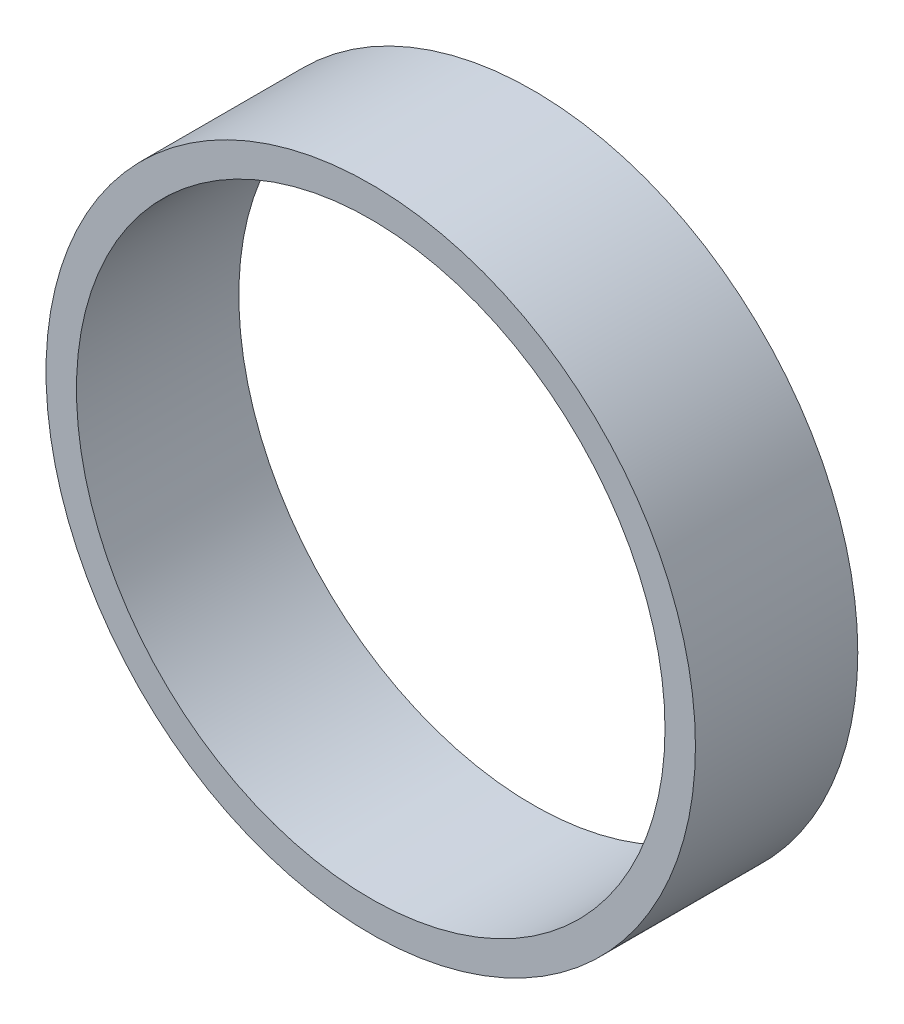
ISO-10303-21;
HEADER;
FILE_DESCRIPTION(('STEP AP214'),'2;1');
FILE_NAME('part.step','',(''),(''),'','','');
FILE_SCHEMA(('AUTOMOTIVE_DESIGN { 1 0 10303 214 1 1 1 1 }'));
ENDSEC;
DATA;
#1=APPLICATION_CONTEXT('core data for automotive mechanical design processes');
#2=APPLICATION_PROTOCOL_DEFINITION('international standard','automotive_design',2000,#1);
#3=PRODUCT_CONTEXT('',#1,'mechanical');
#4=PRODUCT('Part','Part','',(#3));
#5=PRODUCT_RELATED_PRODUCT_CATEGORY('part','',(#4));
#6=PRODUCT_DEFINITION_FORMATION('','',#4);
#7=PRODUCT_DEFINITION_CONTEXT('part definition',#1,'design');
#8=PRODUCT_DEFINITION('design','',#6,#7);
#9=PRODUCT_DEFINITION_SHAPE('','',#8);
#10=(LENGTH_UNIT() NAMED_UNIT(*) SI_UNIT(.MILLI.,.METRE.));
#11=(NAMED_UNIT(*) PLANE_ANGLE_UNIT() SI_UNIT($,.RADIAN.));
#12=(NAMED_UNIT(*) SI_UNIT($,.STERADIAN.) SOLID_ANGLE_UNIT());
#13=UNCERTAINTY_MEASURE_WITH_UNIT(LENGTH_MEASURE(1.E-05),#10,'distance_accuracy_value','');
#14=(GEOMETRIC_REPRESENTATION_CONTEXT(3) GLOBAL_UNCERTAINTY_ASSIGNED_CONTEXT((#13)) GLOBAL_UNIT_ASSIGNED_CONTEXT((#10,
#11,#12)) REPRESENTATION_CONTEXT('',''));
#15=CARTESIAN_POINT('',(0.,0.,0.));
#16=DIRECTION('',(0.,0.,1.));
#17=DIRECTION('',(1.,0.,0.));
#18=AXIS2_PLACEMENT_3D('',#15,#16,#17);
#19=CARTESIAN_POINT('',(0.,0.,20.));
#20=DIRECTION('',(0.,0.,1.));
#21=DIRECTION('',(1.,0.,0.));
#22=AXIS2_PLACEMENT_3D('',#19,#20,#21);
#23=PLANE('',#22);
#24=CARTESIAN_POINT('',(0.,0.,20.));
#25=DIRECTION('',(0.,0.,1.));
#26=DIRECTION('',(1.,0.,0.));
#27=AXIS2_PLACEMENT_3D('',#24,#25,#26);
#28=CIRCLE('',#27,80.);
#29=CARTESIAN_POINT('',(80.,0.,20.));
#30=VERTEX_POINT('',#29);
#31=EDGE_CURVE('E10',#30,#30,#28,.T.);
#32=ORIENTED_EDGE('',*,*,#31,.T.);
#33=EDGE_LOOP('',(#32));
#34=FACE_BOUND('',#33,.T.);
#35=CARTESIAN_POINT('',(0.,0.,20.));
#36=DIRECTION('',(0.,0.,1.));
#37=DIRECTION('',(1.,0.,0.));
#38=AXIS2_PLACEMENT_3D('',#35,#36,#37);
#39=CIRCLE('',#38,72.5);
#40=CARTESIAN_POINT('',(72.5,0.,20.));
#41=VERTEX_POINT('',#40);
#42=EDGE_CURVE('E52',#41,#41,#39,.T.);
#43=ORIENTED_EDGE('',*,*,#42,.F.);
#44=EDGE_LOOP('',(#43));
#45=FACE_BOUND('',#44,.T.);
#46=ADVANCED_FACE('F39',(#34,#45),#23,.T.);
#47=CARTESIAN_POINT('',(0.,0.,-20.));
#48=DIRECTION('',(0.,0.,1.));
#49=DIRECTION('',(1.,0.,0.));
#50=AXIS2_PLACEMENT_3D('',#47,#48,#49);
#51=PLANE('',#50);
#52=CARTESIAN_POINT('',(0.,0.,-20.));
#53=DIRECTION('',(0.,0.,1.));
#54=DIRECTION('',(1.,0.,0.));
#55=AXIS2_PLACEMENT_3D('',#52,#53,#54);
#56=CIRCLE('',#55,80.);
#57=CARTESIAN_POINT('',(80.,0.,-20.));
#58=VERTEX_POINT('',#57);
#59=EDGE_CURVE('E43',#58,#58,#56,.T.);
#60=ORIENTED_EDGE('',*,*,#59,.F.);
#61=EDGE_LOOP('',(#60));
#62=FACE_BOUND('',#61,.T.);
#63=CARTESIAN_POINT('',(0.,0.,-20.));
#64=DIRECTION('',(0.,0.,1.));
#65=DIRECTION('',(1.,0.,0.));
#66=AXIS2_PLACEMENT_3D('',#63,#64,#65);
#67=CIRCLE('',#66,72.5);
#68=CARTESIAN_POINT('',(72.5,0.,-20.));
#69=VERTEX_POINT('',#68);
#70=EDGE_CURVE('E54',#69,#69,#67,.T.);
#71=ORIENTED_EDGE('',*,*,#70,.T.);
#72=EDGE_LOOP('',(#71));
#73=FACE_BOUND('',#72,.T.);
#74=ADVANCED_FACE('F66',(#62,#73),#51,.F.);
#75=CARTESIAN_POINT('',(0.,0.,20.));
#76=DIRECTION('',(0.,0.,-1.));
#77=DIRECTION('',(-1.,0.,0.));
#78=AXIS2_PLACEMENT_3D('',#75,#76,#77);
#79=CYLINDRICAL_SURFACE('',#78,80.);
#80=ORIENTED_EDGE('',*,*,#31,.F.);
#81=EDGE_LOOP('',(#80));
#82=FACE_BOUND('',#81,.T.);
#83=ORIENTED_EDGE('',*,*,#59,.T.);
#84=EDGE_LOOP('',(#83));
#85=FACE_BOUND('',#84,.T.);
#86=ADVANCED_FACE('F41',(#82,#85),#79,.T.);
#87=CARTESIAN_POINT('',(0.,0.,20.));
#88=DIRECTION('',(0.,0.,-1.));
#89=DIRECTION('',(-1.,0.,0.));
#90=AXIS2_PLACEMENT_3D('',#87,#88,#89);
#91=CYLINDRICAL_SURFACE('',#90,72.5);
#92=ORIENTED_EDGE('',*,*,#42,.T.);
#93=EDGE_LOOP('',(#92));
#94=FACE_BOUND('',#93,.T.);
#95=ORIENTED_EDGE('',*,*,#70,.F.);
#96=EDGE_LOOP('',(#95));
#97=FACE_BOUND('',#96,.T.);
#98=ADVANCED_FACE('F62',(#94,#97),#91,.F.);
#99=CLOSED_SHELL('',(#46,#74,#86,#98));
#100=MANIFOLD_SOLID_BREP('B2',#99);
#101=ADVANCED_BREP_SHAPE_REPRESENTATION('',(#18,#100),#14);
#102=SHAPE_DEFINITION_REPRESENTATION(#9,#101);
ENDSEC;
END-ISO-10303-21;
